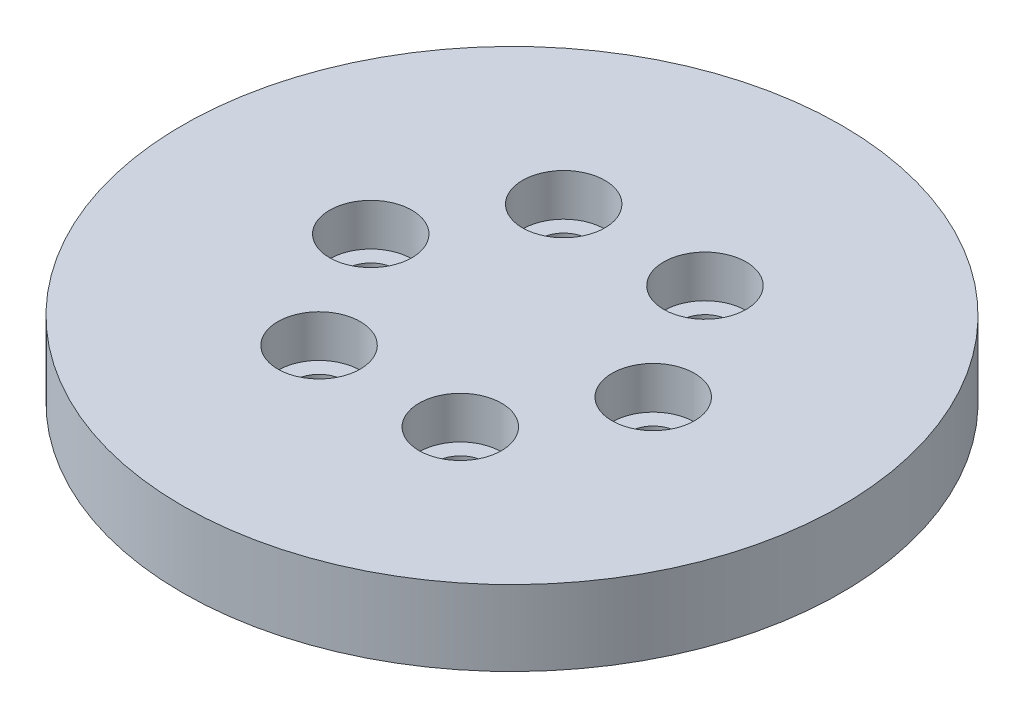
ISO-10303-21;
HEADER;
FILE_DESCRIPTION(('STEP AP214'),'2;1');
FILE_NAME('part.step','',(''),(''),'','','');
FILE_SCHEMA(('AUTOMOTIVE_DESIGN { 1 0 10303 214 1 1 1 1 }'));
ENDSEC;
DATA;
#1=APPLICATION_CONTEXT('core data for automotive mechanical design processes');
#2=APPLICATION_PROTOCOL_DEFINITION('international standard','automotive_design',2000,#1);
#3=PRODUCT_CONTEXT('',#1,'mechanical');
#4=PRODUCT('Part','Part','',(#3));
#5=PRODUCT_RELATED_PRODUCT_CATEGORY('part','',(#4));
#6=PRODUCT_DEFINITION_FORMATION('','',#4);
#7=PRODUCT_DEFINITION_CONTEXT('part definition',#1,'design');
#8=PRODUCT_DEFINITION('design','',#6,#7);
#9=PRODUCT_DEFINITION_SHAPE('','',#8);
#10=(LENGTH_UNIT() NAMED_UNIT(*) SI_UNIT(.MILLI.,.METRE.));
#11=(NAMED_UNIT(*) PLANE_ANGLE_UNIT() SI_UNIT($,.RADIAN.));
#12=(NAMED_UNIT(*) SI_UNIT($,.STERADIAN.) SOLID_ANGLE_UNIT());
#13=UNCERTAINTY_MEASURE_WITH_UNIT(LENGTH_MEASURE(1.E-05),#10,'distance_accuracy_value','');
#14=(GEOMETRIC_REPRESENTATION_CONTEXT(3) GLOBAL_UNCERTAINTY_ASSIGNED_CONTEXT((#13)) GLOBAL_UNIT_ASSIGNED_CONTEXT((#10,
#11,#12)) REPRESENTATION_CONTEXT('',''));
#15=CARTESIAN_POINT('',(0.,0.,0.));
#16=DIRECTION('',(0.,0.,1.));
#17=DIRECTION('',(1.,0.,0.));
#18=AXIS2_PLACEMENT_3D('',#15,#16,#17);
#19=CARTESIAN_POINT('',(0.,5.08,0.));
#20=DIRECTION('',(0.,-1.,0.));
#21=DIRECTION('',(0.,0.,-1.));
#22=AXIS2_PLACEMENT_3D('',#19,#20,#21);
#23=CYLINDRICAL_SURFACE('',#22,22.225);
#24=CARTESIAN_POINT('',(0.,5.08,0.));
#25=DIRECTION('',(0.,1.,0.));
#26=DIRECTION('',(0.,0.,1.));
#27=AXIS2_PLACEMENT_3D('',#24,#25,#26);
#28=CIRCLE('',#27,22.225);
#29=CARTESIAN_POINT('',(0.,5.08,22.225));
#30=VERTEX_POINT('',#29);
#31=EDGE_CURVE('E10',#30,#30,#28,.T.);
#32=ORIENTED_EDGE('',*,*,#31,.F.);
#33=EDGE_LOOP('',(#32));
#34=FACE_BOUND('',#33,.T.);
#35=CARTESIAN_POINT('',(0.,0.,0.));
#36=DIRECTION('',(0.,1.,0.));
#37=DIRECTION('',(0.,0.,1.));
#38=AXIS2_PLACEMENT_3D('',#35,#36,#37);
#39=CIRCLE('',#38,22.225);
#40=CARTESIAN_POINT('',(0.,0.,22.225));
#41=VERTEX_POINT('',#40);
#42=EDGE_CURVE('E34',#41,#41,#39,.T.);
#43=ORIENTED_EDGE('',*,*,#42,.T.);
#44=EDGE_LOOP('',(#43));
#45=FACE_BOUND('',#44,.T.);
#46=ADVANCED_FACE('F31',(#34,#45),#23,.T.);
#47=CARTESIAN_POINT('',(0.,5.08,0.));
#48=DIRECTION('',(0.,1.,0.));
#49=DIRECTION('',(0.,0.,1.));
#50=AXIS2_PLACEMENT_3D('',#47,#48,#49);
#51=PLANE('',#50);
#52=CARTESIAN_POINT('',(-9.525,5.08,0.));
#53=DIRECTION('',(0.,1.,0.));
#54=DIRECTION('',(0.,0.,1.));
#55=AXIS2_PLACEMENT_3D('',#52,#53,#54);
#56=CIRCLE('',#55,2.77876);
#57=CARTESIAN_POINT('',(-9.525,5.08,2.77876));
#58=VERTEX_POINT('',#57);
#59=EDGE_CURVE('E111',#58,#58,#56,.T.);
#60=ORIENTED_EDGE('',*,*,#59,.F.);
#61=EDGE_LOOP('',(#60));
#62=FACE_BOUND('',#61,.T.);
#63=CARTESIAN_POINT('',(-4.7625,5.08,-8.24889197104678));
#64=DIRECTION('',(0.,1.,0.));
#65=DIRECTION('',(0.,0.,1.));
#66=AXIS2_PLACEMENT_3D('',#63,#64,#65);
#67=CIRCLE('',#66,2.77876);
#68=CARTESIAN_POINT('',(-4.7625,5.08,-5.47013197104678));
#69=VERTEX_POINT('',#68);
#70=EDGE_CURVE('E99',#69,#69,#67,.T.);
#71=ORIENTED_EDGE('',*,*,#70,.F.);
#72=EDGE_LOOP('',(#71));
#73=FACE_BOUND('',#72,.T.);
#74=CARTESIAN_POINT('',(4.7625,5.08,-8.24889197104678));
#75=DIRECTION('',(0.,1.,0.));
#76=DIRECTION('',(0.,0.,1.));
#77=AXIS2_PLACEMENT_3D('',#74,#75,#76);
#78=CIRCLE('',#77,2.77876);
#79=CARTESIAN_POINT('',(4.7625,5.08,-5.47013197104678));
#80=VERTEX_POINT('',#79);
#81=EDGE_CURVE('E87',#80,#80,#78,.T.);
#82=ORIENTED_EDGE('',*,*,#81,.F.);
#83=EDGE_LOOP('',(#82));
#84=FACE_BOUND('',#83,.T.);
#85=CARTESIAN_POINT('',(9.525,5.08,0.));
#86=DIRECTION('',(0.,1.,0.));
#87=DIRECTION('',(0.,0.,1.));
#88=AXIS2_PLACEMENT_3D('',#85,#86,#87);
#89=CIRCLE('',#88,2.77876);
#90=CARTESIAN_POINT('',(9.525,5.08,2.77876));
#91=VERTEX_POINT('',#90);
#92=EDGE_CURVE('E75',#91,#91,#89,.T.);
#93=ORIENTED_EDGE('',*,*,#92,.F.);
#94=EDGE_LOOP('',(#93));
#95=FACE_BOUND('',#94,.T.);
#96=CARTESIAN_POINT('',(4.7625,5.08,8.24889197104678));
#97=DIRECTION('',(0.,1.,0.));
#98=DIRECTION('',(0.,0.,1.));
#99=AXIS2_PLACEMENT_3D('',#96,#97,#98);
#100=CIRCLE('',#99,2.77876);
#101=CARTESIAN_POINT('',(4.7625,5.08,11.0276519710468));
#102=VERTEX_POINT('',#101);
#103=EDGE_CURVE('E63',#102,#102,#100,.T.);
#104=ORIENTED_EDGE('',*,*,#103,.F.);
#105=EDGE_LOOP('',(#104));
#106=FACE_BOUND('',#105,.T.);
#107=CARTESIAN_POINT('',(-4.76249999999999,5.08,8.24889197104678));
#108=DIRECTION('',(0.,1.,0.));
#109=DIRECTION('',(0.,0.,1.));
#110=AXIS2_PLACEMENT_3D('',#107,#108,#109);
#111=CIRCLE('',#110,2.77876);
#112=CARTESIAN_POINT('',(-4.76249999999999,5.08,11.0276519710468));
#113=VERTEX_POINT('',#112);
#114=EDGE_CURVE('E51',#113,#113,#111,.T.);
#115=ORIENTED_EDGE('',*,*,#114,.F.);
#116=EDGE_LOOP('',(#115));
#117=FACE_BOUND('',#116,.T.);
#118=ORIENTED_EDGE('',*,*,#31,.T.);
#119=EDGE_LOOP('',(#118));
#120=FACE_BOUND('',#119,.T.);
#121=ADVANCED_FACE('F117',(#62,#73,#84,#95,#106,#117,#120),#51,.T.);
#122=CARTESIAN_POINT('',(0.,0.,0.));
#123=DIRECTION('',(0.,1.,0.));
#124=DIRECTION('',(0.,0.,1.));
#125=AXIS2_PLACEMENT_3D('',#122,#123,#124);
#126=PLANE('',#125);
#127=CARTESIAN_POINT('',(-9.525,0.,0.));
#128=DIRECTION('',(0.,1.,0.));
#129=DIRECTION('',(0.,0.,1.));
#130=AXIS2_PLACEMENT_3D('',#127,#128,#129);
#131=CIRCLE('',#130,1.63195);
#132=CARTESIAN_POINT('',(-9.525,0.,1.63195));
#133=VERTEX_POINT('',#132);
#134=EDGE_CURVE('E102',#133,#133,#131,.T.);
#135=ORIENTED_EDGE('',*,*,#134,.T.);
#136=EDGE_LOOP('',(#135));
#137=FACE_BOUND('',#136,.T.);
#138=CARTESIAN_POINT('',(-4.7625,0.,-8.24889197104678));
#139=DIRECTION('',(0.,1.,0.));
#140=DIRECTION('',(0.,0.,1.));
#141=AXIS2_PLACEMENT_3D('',#138,#139,#140);
#142=CIRCLE('',#141,1.63195);
#143=CARTESIAN_POINT('',(-4.7625,0.,-6.61694197104678));
#144=VERTEX_POINT('',#143);
#145=EDGE_CURVE('E90',#144,#144,#142,.T.);
#146=ORIENTED_EDGE('',*,*,#145,.T.);
#147=EDGE_LOOP('',(#146));
#148=FACE_BOUND('',#147,.T.);
#149=CARTESIAN_POINT('',(4.7625,0.,-8.24889197104678));
#150=DIRECTION('',(0.,1.,0.));
#151=DIRECTION('',(0.,0.,1.));
#152=AXIS2_PLACEMENT_3D('',#149,#150,#151);
#153=CIRCLE('',#152,1.63195);
#154=CARTESIAN_POINT('',(4.7625,0.,-6.61694197104678));
#155=VERTEX_POINT('',#154);
#156=EDGE_CURVE('E78',#155,#155,#153,.T.);
#157=ORIENTED_EDGE('',*,*,#156,.T.);
#158=EDGE_LOOP('',(#157));
#159=FACE_BOUND('',#158,.T.);
#160=CARTESIAN_POINT('',(9.525,0.,0.));
#161=DIRECTION('',(0.,1.,0.));
#162=DIRECTION('',(0.,0.,1.));
#163=AXIS2_PLACEMENT_3D('',#160,#161,#162);
#164=CIRCLE('',#163,1.63195);
#165=CARTESIAN_POINT('',(9.525,0.,1.63195));
#166=VERTEX_POINT('',#165);
#167=EDGE_CURVE('E66',#166,#166,#164,.T.);
#168=ORIENTED_EDGE('',*,*,#167,.T.);
#169=EDGE_LOOP('',(#168));
#170=FACE_BOUND('',#169,.T.);
#171=CARTESIAN_POINT('',(4.7625,0.,8.24889197104678));
#172=DIRECTION('',(0.,1.,0.));
#173=DIRECTION('',(0.,0.,1.));
#174=AXIS2_PLACEMENT_3D('',#171,#172,#173);
#175=CIRCLE('',#174,1.63195);
#176=CARTESIAN_POINT('',(4.7625,0.,9.88084197104678));
#177=VERTEX_POINT('',#176);
#178=EDGE_CURVE('E54',#177,#177,#175,.T.);
#179=ORIENTED_EDGE('',*,*,#178,.T.);
#180=EDGE_LOOP('',(#179));
#181=FACE_BOUND('',#180,.T.);
#182=CARTESIAN_POINT('',(-4.76249999999999,0.,8.24889197104678));
#183=DIRECTION('',(0.,1.,0.));
#184=DIRECTION('',(0.,0.,1.));
#185=AXIS2_PLACEMENT_3D('',#182,#183,#184);
#186=CIRCLE('',#185,1.63195);
#187=CARTESIAN_POINT('',(-4.76249999999999,0.,9.88084197104678));
#188=VERTEX_POINT('',#187);
#189=EDGE_CURVE('E41',#188,#188,#186,.T.);
#190=ORIENTED_EDGE('',*,*,#189,.T.);
#191=EDGE_LOOP('',(#190));
#192=FACE_BOUND('',#191,.T.);
#193=ORIENTED_EDGE('',*,*,#42,.F.);
#194=EDGE_LOOP('',(#193));
#195=FACE_BOUND('',#194,.T.);
#196=ADVANCED_FACE('F120',(#137,#148,#159,#170,#181,#192,#195),#126,.F.);
#197=CARTESIAN_POINT('',(-4.76249999999999,5.08,8.24889197104678));
#198=DIRECTION('',(0.,1.,0.));
#199=DIRECTION('',(0.,0.,1.));
#200=AXIS2_PLACEMENT_3D('',#197,#198,#199);
#201=CYLINDRICAL_SURFACE('',#200,1.63195);
#202=ORIENTED_EDGE('',*,*,#189,.F.);
#203=EDGE_LOOP('',(#202));
#204=FACE_BOUND('',#203,.T.);
#205=CARTESIAN_POINT('',(-4.76249999999999,2.2352,8.24889197104678));
#206=DIRECTION('',(0.,1.,0.));
#207=DIRECTION('',(0.,0.,1.));
#208=AXIS2_PLACEMENT_3D('',#205,#206,#207);
#209=CIRCLE('',#208,1.63195);
#210=CARTESIAN_POINT('',(-4.76249999999999,2.2352,9.88084197104678));
#211=VERTEX_POINT('',#210);
#212=EDGE_CURVE('E45',#211,#211,#209,.T.);
#213=ORIENTED_EDGE('',*,*,#212,.T.);
#214=EDGE_LOOP('',(#213));
#215=FACE_BOUND('',#214,.T.);
#216=ADVANCED_FACE('F145',(#204,#215),#201,.F.);
#217=CARTESIAN_POINT('',(-3.13054999999999,2.2352,8.24889197104678));
#218=DIRECTION('',(0.,-1.,0.));
#219=DIRECTION('',(0.,0.,-1.));
#220=AXIS2_PLACEMENT_3D('',#217,#218,#219);
#221=PLANE('',#220);
#222=ORIENTED_EDGE('',*,*,#212,.F.);
#223=EDGE_LOOP('',(#222));
#224=FACE_BOUND('',#223,.T.);
#225=CARTESIAN_POINT('',(-4.76249999999999,2.2352,8.24889197104678));
#226=DIRECTION('',(0.,1.,0.));
#227=DIRECTION('',(0.,0.,1.));
#228=AXIS2_PLACEMENT_3D('',#225,#226,#227);
#229=CIRCLE('',#228,2.77876);
#230=CARTESIAN_POINT('',(-4.76249999999999,2.2352,11.0276519710468));
#231=VERTEX_POINT('',#230);
#232=EDGE_CURVE('E48',#231,#231,#229,.T.);
#233=ORIENTED_EDGE('',*,*,#232,.T.);
#234=EDGE_LOOP('',(#233));
#235=FACE_BOUND('',#234,.T.);
#236=ADVANCED_FACE('F135',(#224,#235),#221,.F.);
#237=CARTESIAN_POINT('',(-4.76249999999999,5.08,8.24889197104678));
#238=DIRECTION('',(0.,1.,0.));
#239=DIRECTION('',(0.,0.,1.));
#240=AXIS2_PLACEMENT_3D('',#237,#238,#239);
#241=CYLINDRICAL_SURFACE('',#240,2.77876);
#242=ORIENTED_EDGE('',*,*,#232,.F.);
#243=EDGE_LOOP('',(#242));
#244=FACE_BOUND('',#243,.T.);
#245=ORIENTED_EDGE('',*,*,#114,.T.);
#246=EDGE_LOOP('',(#245));
#247=FACE_BOUND('',#246,.T.);
#248=ADVANCED_FACE('F132',(#244,#247),#241,.F.);
#249=CARTESIAN_POINT('',(4.7625,5.08,8.24889197104678));
#250=DIRECTION('',(0.,1.,0.));
#251=DIRECTION('',(0.,0.,1.));
#252=AXIS2_PLACEMENT_3D('',#249,#250,#251);
#253=CYLINDRICAL_SURFACE('',#252,1.63195);
#254=ORIENTED_EDGE('',*,*,#178,.F.);
#255=EDGE_LOOP('',(#254));
#256=FACE_BOUND('',#255,.T.);
#257=CARTESIAN_POINT('',(4.7625,2.2352,8.24889197104678));
#258=DIRECTION('',(0.,1.,0.));
#259=DIRECTION('',(0.,0.,1.));
#260=AXIS2_PLACEMENT_3D('',#257,#258,#259);
#261=CIRCLE('',#260,1.63195);
#262=CARTESIAN_POINT('',(4.7625,2.2352,9.88084197104678));
#263=VERTEX_POINT('',#262);
#264=EDGE_CURVE('E57',#263,#263,#261,.T.);
#265=ORIENTED_EDGE('',*,*,#264,.T.);
#266=EDGE_LOOP('',(#265));
#267=FACE_BOUND('',#266,.T.);
#268=ADVANCED_FACE('F134',(#256,#267),#253,.F.);
#269=CARTESIAN_POINT('',(6.39445,2.2352,8.24889197104678));
#270=DIRECTION('',(0.,-1.,0.));
#271=DIRECTION('',(0.,0.,-1.));
#272=AXIS2_PLACEMENT_3D('',#269,#270,#271);
#273=PLANE('',#272);
#274=ORIENTED_EDGE('',*,*,#264,.F.);
#275=EDGE_LOOP('',(#274));
#276=FACE_BOUND('',#275,.T.);
#277=CARTESIAN_POINT('',(4.7625,2.2352,8.24889197104678));
#278=DIRECTION('',(0.,1.,0.));
#279=DIRECTION('',(0.,0.,1.));
#280=AXIS2_PLACEMENT_3D('',#277,#278,#279);
#281=CIRCLE('',#280,2.77876);
#282=CARTESIAN_POINT('',(4.7625,2.2352,11.0276519710468));
#283=VERTEX_POINT('',#282);
#284=EDGE_CURVE('E60',#283,#283,#281,.T.);
#285=ORIENTED_EDGE('',*,*,#284,.T.);
#286=EDGE_LOOP('',(#285));
#287=FACE_BOUND('',#286,.T.);
#288=ADVANCED_FACE('F142',(#276,#287),#273,.F.);
#289=CARTESIAN_POINT('',(4.7625,5.08,8.24889197104678));
#290=DIRECTION('',(0.,1.,0.));
#291=DIRECTION('',(0.,0.,1.));
#292=AXIS2_PLACEMENT_3D('',#289,#290,#291);
#293=CYLINDRICAL_SURFACE('',#292,2.77876);
#294=ORIENTED_EDGE('',*,*,#284,.F.);
#295=EDGE_LOOP('',(#294));
#296=FACE_BOUND('',#295,.T.);
#297=ORIENTED_EDGE('',*,*,#103,.T.);
#298=EDGE_LOOP('',(#297));
#299=FACE_BOUND('',#298,.T.);
#300=ADVANCED_FACE('F182',(#296,#299),#293,.F.);
#301=CARTESIAN_POINT('',(9.525,5.08,0.));
#302=DIRECTION('',(0.,1.,0.));
#303=DIRECTION('',(0.,0.,1.));
#304=AXIS2_PLACEMENT_3D('',#301,#302,#303);
#305=CYLINDRICAL_SURFACE('',#304,1.63195);
#306=ORIENTED_EDGE('',*,*,#167,.F.);
#307=EDGE_LOOP('',(#306));
#308=FACE_BOUND('',#307,.T.);
#309=CARTESIAN_POINT('',(9.525,2.2352,0.));
#310=DIRECTION('',(0.,1.,0.));
#311=DIRECTION('',(0.,0.,1.));
#312=AXIS2_PLACEMENT_3D('',#309,#310,#311);
#313=CIRCLE('',#312,1.63195);
#314=CARTESIAN_POINT('',(9.525,2.2352,1.63195));
#315=VERTEX_POINT('',#314);
#316=EDGE_CURVE('E69',#315,#315,#313,.T.);
#317=ORIENTED_EDGE('',*,*,#316,.T.);
#318=EDGE_LOOP('',(#317));
#319=FACE_BOUND('',#318,.T.);
#320=ADVANCED_FACE('F188',(#308,#319),#305,.F.);
#321=CARTESIAN_POINT('',(11.15695,2.2352,0.));
#322=DIRECTION('',(0.,-1.,0.));
#323=DIRECTION('',(0.,0.,-1.));
#324=AXIS2_PLACEMENT_3D('',#321,#322,#323);
#325=PLANE('',#324);
#326=ORIENTED_EDGE('',*,*,#316,.F.);
#327=EDGE_LOOP('',(#326));
#328=FACE_BOUND('',#327,.T.);
#329=CARTESIAN_POINT('',(9.525,2.2352,0.));
#330=DIRECTION('',(0.,1.,0.));
#331=DIRECTION('',(0.,0.,1.));
#332=AXIS2_PLACEMENT_3D('',#329,#330,#331);
#333=CIRCLE('',#332,2.77876);
#334=CARTESIAN_POINT('',(9.525,2.2352,2.77876));
#335=VERTEX_POINT('',#334);
#336=EDGE_CURVE('E72',#335,#335,#333,.T.);
#337=ORIENTED_EDGE('',*,*,#336,.T.);
#338=EDGE_LOOP('',(#337));
#339=FACE_BOUND('',#338,.T.);
#340=ADVANCED_FACE('F193',(#328,#339),#325,.F.);
#341=CARTESIAN_POINT('',(9.525,5.08,0.));
#342=DIRECTION('',(0.,1.,0.));
#343=DIRECTION('',(0.,0.,1.));
#344=AXIS2_PLACEMENT_3D('',#341,#342,#343);
#345=CYLINDRICAL_SURFACE('',#344,2.77876);
#346=ORIENTED_EDGE('',*,*,#336,.F.);
#347=EDGE_LOOP('',(#346));
#348=FACE_BOUND('',#347,.T.);
#349=ORIENTED_EDGE('',*,*,#92,.T.);
#350=EDGE_LOOP('',(#349));
#351=FACE_BOUND('',#350,.T.);
#352=ADVANCED_FACE('F199',(#348,#351),#345,.F.);
#353=CARTESIAN_POINT('',(4.7625,5.08,-8.24889197104678));
#354=DIRECTION('',(0.,1.,0.));
#355=DIRECTION('',(0.,0.,1.));
#356=AXIS2_PLACEMENT_3D('',#353,#354,#355);
#357=CYLINDRICAL_SURFACE('',#356,1.63195);
#358=ORIENTED_EDGE('',*,*,#156,.F.);
#359=EDGE_LOOP('',(#358));
#360=FACE_BOUND('',#359,.T.);
#361=CARTESIAN_POINT('',(4.7625,2.2352,-8.24889197104678));
#362=DIRECTION('',(0.,1.,0.));
#363=DIRECTION('',(0.,0.,1.));
#364=AXIS2_PLACEMENT_3D('',#361,#362,#363);
#365=CIRCLE('',#364,1.63195);
#366=CARTESIAN_POINT('',(4.7625,2.2352,-6.61694197104678));
#367=VERTEX_POINT('',#366);
#368=EDGE_CURVE('E81',#367,#367,#365,.T.);
#369=ORIENTED_EDGE('',*,*,#368,.T.);
#370=EDGE_LOOP('',(#369));
#371=FACE_BOUND('',#370,.T.);
#372=ADVANCED_FACE('F203',(#360,#371),#357,.F.);
#373=CARTESIAN_POINT('',(6.39445,2.2352,-8.24889197104678));
#374=DIRECTION('',(0.,-1.,0.));
#375=DIRECTION('',(0.,0.,-1.));
#376=AXIS2_PLACEMENT_3D('',#373,#374,#375);
#377=PLANE('',#376);
#378=ORIENTED_EDGE('',*,*,#368,.F.);
#379=EDGE_LOOP('',(#378));
#380=FACE_BOUND('',#379,.T.);
#381=CARTESIAN_POINT('',(4.7625,2.2352,-8.24889197104678));
#382=DIRECTION('',(0.,1.,0.));
#383=DIRECTION('',(0.,0.,1.));
#384=AXIS2_PLACEMENT_3D('',#381,#382,#383);
#385=CIRCLE('',#384,2.77876);
#386=CARTESIAN_POINT('',(4.7625,2.2352,-5.47013197104678));
#387=VERTEX_POINT('',#386);
#388=EDGE_CURVE('E84',#387,#387,#385,.T.);
#389=ORIENTED_EDGE('',*,*,#388,.T.);
#390=EDGE_LOOP('',(#389));
#391=FACE_BOUND('',#390,.T.);
#392=ADVANCED_FACE('F207',(#380,#391),#377,.F.);
#393=CARTESIAN_POINT('',(4.7625,5.08,-8.24889197104678));
#394=DIRECTION('',(0.,1.,0.));
#395=DIRECTION('',(0.,0.,1.));
#396=AXIS2_PLACEMENT_3D('',#393,#394,#395);
#397=CYLINDRICAL_SURFACE('',#396,2.77876);
#398=ORIENTED_EDGE('',*,*,#388,.F.);
#399=EDGE_LOOP('',(#398));
#400=FACE_BOUND('',#399,.T.);
#401=ORIENTED_EDGE('',*,*,#81,.T.);
#402=EDGE_LOOP('',(#401));
#403=FACE_BOUND('',#402,.T.);
#404=ADVANCED_FACE('F211',(#400,#403),#397,.F.);
#405=CARTESIAN_POINT('',(-4.7625,5.08,-8.24889197104678));
#406=DIRECTION('',(0.,1.,0.));
#407=DIRECTION('',(0.,0.,1.));
#408=AXIS2_PLACEMENT_3D('',#405,#406,#407);
#409=CYLINDRICAL_SURFACE('',#408,1.63195);
#410=ORIENTED_EDGE('',*,*,#145,.F.);
#411=EDGE_LOOP('',(#410));
#412=FACE_BOUND('',#411,.T.);
#413=CARTESIAN_POINT('',(-4.7625,2.2352,-8.24889197104678));
#414=DIRECTION('',(0.,1.,0.));
#415=DIRECTION('',(0.,0.,1.));
#416=AXIS2_PLACEMENT_3D('',#413,#414,#415);
#417=CIRCLE('',#416,1.63195);
#418=CARTESIAN_POINT('',(-4.7625,2.2352,-6.61694197104678));
#419=VERTEX_POINT('',#418);
#420=EDGE_CURVE('E93',#419,#419,#417,.T.);
#421=ORIENTED_EDGE('',*,*,#420,.T.);
#422=EDGE_LOOP('',(#421));
#423=FACE_BOUND('',#422,.T.);
#424=ADVANCED_FACE('F215',(#412,#423),#409,.F.);
#425=CARTESIAN_POINT('',(-3.13055,2.2352,-8.24889197104678));
#426=DIRECTION('',(0.,-1.,0.));
#427=DIRECTION('',(0.,0.,-1.));
#428=AXIS2_PLACEMENT_3D('',#425,#426,#427);
#429=PLANE('',#428);
#430=ORIENTED_EDGE('',*,*,#420,.F.);
#431=EDGE_LOOP('',(#430));
#432=FACE_BOUND('',#431,.T.);
#433=CARTESIAN_POINT('',(-4.7625,2.2352,-8.24889197104678));
#434=DIRECTION('',(0.,1.,0.));
#435=DIRECTION('',(0.,0.,1.));
#436=AXIS2_PLACEMENT_3D('',#433,#434,#435);
#437=CIRCLE('',#436,2.77876);
#438=CARTESIAN_POINT('',(-4.7625,2.2352,-5.47013197104678));
#439=VERTEX_POINT('',#438);
#440=EDGE_CURVE('E96',#439,#439,#437,.T.);
#441=ORIENTED_EDGE('',*,*,#440,.T.);
#442=EDGE_LOOP('',(#441));
#443=FACE_BOUND('',#442,.T.);
#444=ADVANCED_FACE('F219',(#432,#443),#429,.F.);
#445=CARTESIAN_POINT('',(-4.7625,5.08,-8.24889197104678));
#446=DIRECTION('',(0.,1.,0.));
#447=DIRECTION('',(0.,0.,1.));
#448=AXIS2_PLACEMENT_3D('',#445,#446,#447);
#449=CYLINDRICAL_SURFACE('',#448,2.77876);
#450=ORIENTED_EDGE('',*,*,#440,.F.);
#451=EDGE_LOOP('',(#450));
#452=FACE_BOUND('',#451,.T.);
#453=ORIENTED_EDGE('',*,*,#70,.T.);
#454=EDGE_LOOP('',(#453));
#455=FACE_BOUND('',#454,.T.);
#456=ADVANCED_FACE('F223',(#452,#455),#449,.F.);
#457=CARTESIAN_POINT('',(-9.525,5.08,0.));
#458=DIRECTION('',(0.,1.,0.));
#459=DIRECTION('',(0.,0.,1.));
#460=AXIS2_PLACEMENT_3D('',#457,#458,#459);
#461=CYLINDRICAL_SURFACE('',#460,1.63195);
#462=ORIENTED_EDGE('',*,*,#134,.F.);
#463=EDGE_LOOP('',(#462));
#464=FACE_BOUND('',#463,.T.);
#465=CARTESIAN_POINT('',(-9.525,2.2352,0.));
#466=DIRECTION('',(0.,1.,0.));
#467=DIRECTION('',(0.,0.,1.));
#468=AXIS2_PLACEMENT_3D('',#465,#466,#467);
#469=CIRCLE('',#468,1.63195);
#470=CARTESIAN_POINT('',(-9.525,2.2352,1.63195));
#471=VERTEX_POINT('',#470);
#472=EDGE_CURVE('E105',#471,#471,#469,.T.);
#473=ORIENTED_EDGE('',*,*,#472,.T.);
#474=EDGE_LOOP('',(#473));
#475=FACE_BOUND('',#474,.T.);
#476=ADVANCED_FACE('F227',(#464,#475),#461,.F.);
#477=CARTESIAN_POINT('',(-7.89305,2.2352,0.));
#478=DIRECTION('',(0.,-1.,0.));
#479=DIRECTION('',(0.,0.,-1.));
#480=AXIS2_PLACEMENT_3D('',#477,#478,#479);
#481=PLANE('',#480);
#482=ORIENTED_EDGE('',*,*,#472,.F.);
#483=EDGE_LOOP('',(#482));
#484=FACE_BOUND('',#483,.T.);
#485=CARTESIAN_POINT('',(-9.525,2.2352,0.));
#486=DIRECTION('',(0.,1.,0.));
#487=DIRECTION('',(0.,0.,1.));
#488=AXIS2_PLACEMENT_3D('',#485,#486,#487);
#489=CIRCLE('',#488,2.77876);
#490=CARTESIAN_POINT('',(-9.525,2.2352,2.77876));
#491=VERTEX_POINT('',#490);
#492=EDGE_CURVE('E108',#491,#491,#489,.T.);
#493=ORIENTED_EDGE('',*,*,#492,.T.);
#494=EDGE_LOOP('',(#493));
#495=FACE_BOUND('',#494,.T.);
#496=ADVANCED_FACE('F231',(#484,#495),#481,.F.);
#497=CARTESIAN_POINT('',(-9.525,5.08,0.));
#498=DIRECTION('',(0.,1.,0.));
#499=DIRECTION('',(0.,0.,1.));
#500=AXIS2_PLACEMENT_3D('',#497,#498,#499);
#501=CYLINDRICAL_SURFACE('',#500,2.77876);
#502=ORIENTED_EDGE('',*,*,#492,.F.);
#503=EDGE_LOOP('',(#502));
#504=FACE_BOUND('',#503,.T.);
#505=ORIENTED_EDGE('',*,*,#59,.T.);
#506=EDGE_LOOP('',(#505));
#507=FACE_BOUND('',#506,.T.);
#508=ADVANCED_FACE('F115',(#504,#507),#501,.F.);
#509=CLOSED_SHELL('',(#46,#121,#196,#216,#236,#248,#268,#288,#300,#320,#340,#352,#372,#392,#404,
#424,#444,#456,#476,#496,#508));
#510=MANIFOLD_SOLID_BREP('B2',#509);
#511=ADVANCED_BREP_SHAPE_REPRESENTATION('',(#18,#510),#14);
#512=SHAPE_DEFINITION_REPRESENTATION(#9,#511);
ENDSEC;
END-ISO-10303-21;
